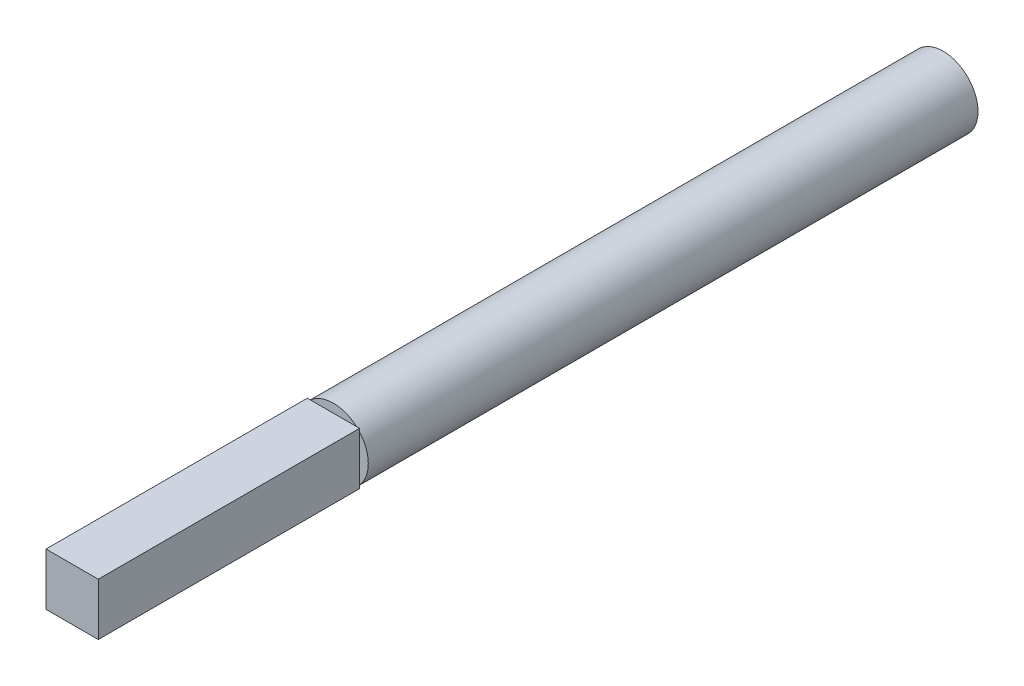
ISO-10303-21;
HEADER;
FILE_DESCRIPTION(('STEP AP214'),'2;1');
FILE_NAME('part.step','',(''),(''),'','','');
FILE_SCHEMA(('AUTOMOTIVE_DESIGN { 1 0 10303 214 1 1 1 1 }'));
ENDSEC;
DATA;
#1=APPLICATION_CONTEXT('core data for automotive mechanical design processes');
#2=APPLICATION_PROTOCOL_DEFINITION('international standard','automotive_design',2000,#1);
#3=PRODUCT_CONTEXT('',#1,'mechanical');
#4=PRODUCT('Part','Part','',(#3));
#5=PRODUCT_RELATED_PRODUCT_CATEGORY('part','',(#4));
#6=PRODUCT_DEFINITION_FORMATION('','',#4);
#7=PRODUCT_DEFINITION_CONTEXT('part definition',#1,'design');
#8=PRODUCT_DEFINITION('design','',#6,#7);
#9=PRODUCT_DEFINITION_SHAPE('','',#8);
#10=(LENGTH_UNIT() NAMED_UNIT(*) SI_UNIT(.MILLI.,.METRE.));
#11=(NAMED_UNIT(*) PLANE_ANGLE_UNIT() SI_UNIT($,.RADIAN.));
#12=(NAMED_UNIT(*) SI_UNIT($,.STERADIAN.) SOLID_ANGLE_UNIT());
#13=UNCERTAINTY_MEASURE_WITH_UNIT(LENGTH_MEASURE(1.E-05),#10,'distance_accuracy_value','');
#14=(GEOMETRIC_REPRESENTATION_CONTEXT(3) GLOBAL_UNCERTAINTY_ASSIGNED_CONTEXT((#13)) GLOBAL_UNIT_ASSIGNED_CONTEXT((#10,
#11,#12)) REPRESENTATION_CONTEXT('',''));
#15=CARTESIAN_POINT('',(0.,0.,0.));
#16=DIRECTION('',(0.,0.,1.));
#17=DIRECTION('',(1.,0.,0.));
#18=AXIS2_PLACEMENT_3D('',#15,#16,#17);
#19=CARTESIAN_POINT('',(0.,0.,88.9));
#20=DIRECTION('',(0.,0.,1.));
#21=DIRECTION('',(1.,0.,0.));
#22=AXIS2_PLACEMENT_3D('',#19,#20,#21);
#23=PLANE('',#22);
#24=DIRECTION('',(0.,1.,0.));
#25=VECTOR('',#24,1.);
#26=CARTESIAN_POINT('',(3.81,3.81,88.9));
#27=LINE('',#26,#25);
#28=CARTESIAN_POINT('',(3.81,-3.36010416505203,88.9));
#29=VERTEX_POINT('',#28);
#30=CARTESIAN_POINT('',(3.81,3.36010416505203,88.9));
#31=VERTEX_POINT('',#30);
#32=EDGE_CURVE('E11',#29,#31,#27,.T.);
#33=ORIENTED_EDGE('',*,*,#32,.F.);
#34=CARTESIAN_POINT('',(0.,0.,88.9));
#35=DIRECTION('',(0.,0.,1.));
#36=DIRECTION('',(1.,0.,0.));
#37=AXIS2_PLACEMENT_3D('',#34,#35,#36);
#38=CIRCLE('',#37,5.08);
#39=EDGE_CURVE('E129',#29,#31,#38,.T.);
#40=ORIENTED_EDGE('',*,*,#39,.T.);
#41=EDGE_LOOP('',(#33,#40));
#42=FACE_BOUND('',#41,.T.);
#43=ADVANCED_FACE('F33',(#42),#23,.T.);
#44=DIRECTION('',(1.,0.,0.));
#45=VECTOR('',#44,1.);
#46=CARTESIAN_POINT('',(-3.81,-3.81,88.9));
#47=LINE('',#46,#45);
#48=CARTESIAN_POINT('',(-3.36010416505203,-3.81,88.9));
#49=VERTEX_POINT('',#48);
#50=CARTESIAN_POINT('',(3.36010416505203,-3.81,88.9));
#51=VERTEX_POINT('',#50);
#52=EDGE_CURVE('E42',#49,#51,#47,.T.);
#53=ORIENTED_EDGE('',*,*,#52,.F.);
#54=EDGE_CURVE('E145',#49,#51,#38,.T.);
#55=ORIENTED_EDGE('',*,*,#54,.T.);
#56=EDGE_LOOP('',(#53,#55));
#57=FACE_BOUND('',#56,.T.);
#58=ADVANCED_FACE('F203',(#57),#23,.T.);
#59=DIRECTION('',(0.,-1.,0.));
#60=VECTOR('',#59,1.);
#61=CARTESIAN_POINT('',(-3.81,3.81,88.9));
#62=LINE('',#61,#60);
#63=CARTESIAN_POINT('',(-3.81,3.36010416505203,88.9));
#64=VERTEX_POINT('',#63);
#65=CARTESIAN_POINT('',(-3.81,-3.36010416505203,88.9));
#66=VERTEX_POINT('',#65);
#67=EDGE_CURVE('E140',#64,#66,#62,.T.);
#68=ORIENTED_EDGE('',*,*,#67,.F.);
#69=EDGE_CURVE('E152',#64,#66,#38,.T.);
#70=ORIENTED_EDGE('',*,*,#69,.T.);
#71=EDGE_LOOP('',(#68,#70));
#72=FACE_BOUND('',#71,.T.);
#73=ADVANCED_FACE('F208',(#72),#23,.T.);
#74=CARTESIAN_POINT('',(0.,0.,88.9));
#75=DIRECTION('',(0.,0.,-1.));
#76=DIRECTION('',(-1.,0.,0.));
#77=AXIS2_PLACEMENT_3D('',#74,#75,#76);
#78=CYLINDRICAL_SURFACE('',#77,5.08);
#79=CARTESIAN_POINT('',(3.36010416505203,3.81,88.9));
#80=VERTEX_POINT('',#79);
#81=EDGE_CURVE('E133',#31,#80,#38,.T.);
#82=ORIENTED_EDGE('',*,*,#81,.F.);
#83=ORIENTED_EDGE('',*,*,#39,.F.);
#84=EDGE_CURVE('E56',#51,#29,#38,.T.);
#85=ORIENTED_EDGE('',*,*,#84,.F.);
#86=ORIENTED_EDGE('',*,*,#54,.F.);
#87=EDGE_CURVE('E149',#66,#49,#38,.T.);
#88=ORIENTED_EDGE('',*,*,#87,.F.);
#89=ORIENTED_EDGE('',*,*,#69,.F.);
#90=CARTESIAN_POINT('',(-3.36010416505203,3.81,88.9));
#91=VERTEX_POINT('',#90);
#92=EDGE_CURVE('E144',#91,#64,#38,.T.);
#93=ORIENTED_EDGE('',*,*,#92,.F.);
#94=EDGE_CURVE('E136',#80,#91,#38,.T.);
#95=ORIENTED_EDGE('',*,*,#94,.F.);
#96=EDGE_LOOP('',(#82,#83,#85,#86,#88,#89,#93,#95));
#97=FACE_BOUND('',#96,.T.);
#98=CARTESIAN_POINT('',(0.,0.,0.));
#99=DIRECTION('',(0.,0.,1.));
#100=DIRECTION('',(1.,0.,0.));
#101=AXIS2_PLACEMENT_3D('',#98,#99,#100);
#102=CIRCLE('',#101,5.08);
#103=CARTESIAN_POINT('',(5.08,0.,0.));
#104=VERTEX_POINT('',#103);
#105=EDGE_CURVE('E37',#104,#104,#102,.T.);
#106=ORIENTED_EDGE('',*,*,#105,.T.);
#107=EDGE_LOOP('',(#106));
#108=FACE_BOUND('',#107,.T.);
#109=ADVANCED_FACE('F35',(#97,#108),#78,.T.);
#110=DIRECTION('',(-1.,0.,0.));
#111=VECTOR('',#110,1.);
#112=CARTESIAN_POINT('',(-3.81,3.81,88.9));
#113=LINE('',#112,#111);
#114=EDGE_CURVE('E135',#80,#91,#113,.T.);
#115=ORIENTED_EDGE('',*,*,#114,.F.);
#116=ORIENTED_EDGE('',*,*,#94,.T.);
#117=EDGE_LOOP('',(#115,#116));
#118=FACE_BOUND('',#117,.T.);
#119=ADVANCED_FACE('F187',(#118),#23,.T.);
#120=CARTESIAN_POINT('',(0.,0.,0.));
#121=DIRECTION('',(0.,0.,1.));
#122=DIRECTION('',(1.,0.,0.));
#123=AXIS2_PLACEMENT_3D('',#120,#121,#122);
#124=PLANE('',#123);
#125=ORIENTED_EDGE('',*,*,#105,.F.);
#126=EDGE_LOOP('',(#125));
#127=FACE_BOUND('',#126,.T.);
#128=ADVANCED_FACE('F201',(#127),#124,.F.);
#129=CARTESIAN_POINT('',(0.,0.,88.9));
#130=DIRECTION('',(0.,0.,1.));
#131=DIRECTION('',(1.,0.,0.));
#132=AXIS2_PLACEMENT_3D('',#129,#130,#131);
#133=PLANE('',#132);
#134=CARTESIAN_POINT('',(3.81,3.81,88.9));
#135=VERTEX_POINT('',#134);
#136=EDGE_CURVE('E45',#31,#135,#27,.T.);
#137=ORIENTED_EDGE('',*,*,#136,.F.);
#138=ORIENTED_EDGE('',*,*,#81,.T.);
#139=EDGE_CURVE('E142',#135,#80,#113,.T.);
#140=ORIENTED_EDGE('',*,*,#139,.F.);
#141=EDGE_LOOP('',(#137,#138,#140));
#142=FACE_BOUND('',#141,.T.);
#143=ADVANCED_FACE('F189',(#142),#133,.F.);
#144=CARTESIAN_POINT('',(-3.81,3.81,88.9));
#145=VERTEX_POINT('',#144);
#146=EDGE_CURVE('E143',#91,#145,#113,.T.);
#147=ORIENTED_EDGE('',*,*,#146,.F.);
#148=ORIENTED_EDGE('',*,*,#92,.T.);
#149=EDGE_CURVE('E167',#145,#64,#62,.T.);
#150=ORIENTED_EDGE('',*,*,#149,.F.);
#151=EDGE_LOOP('',(#147,#148,#150));
#152=FACE_BOUND('',#151,.T.);
#153=ADVANCED_FACE('F166',(#152),#133,.F.);
#154=CARTESIAN_POINT('',(-3.81,-3.81,88.9));
#155=VERTEX_POINT('',#154);
#156=EDGE_CURVE('E173',#66,#155,#62,.T.);
#157=ORIENTED_EDGE('',*,*,#156,.F.);
#158=ORIENTED_EDGE('',*,*,#87,.T.);
#159=EDGE_CURVE('E121',#155,#49,#47,.T.);
#160=ORIENTED_EDGE('',*,*,#159,.F.);
#161=EDGE_LOOP('',(#157,#158,#160));
#162=FACE_BOUND('',#161,.T.);
#163=ADVANCED_FACE('F182',(#162),#133,.F.);
#164=CARTESIAN_POINT('',(3.81,-3.81,88.9));
#165=VERTEX_POINT('',#164);
#166=EDGE_CURVE('E172',#51,#165,#47,.T.);
#167=ORIENTED_EDGE('',*,*,#166,.F.);
#168=ORIENTED_EDGE('',*,*,#84,.T.);
#169=EDGE_CURVE('E44',#165,#29,#27,.T.);
#170=ORIENTED_EDGE('',*,*,#169,.F.);
#171=EDGE_LOOP('',(#167,#168,#170));
#172=FACE_BOUND('',#171,.T.);
#173=ADVANCED_FACE('F190',(#172),#133,.F.);
#174=CARTESIAN_POINT('',(3.81,3.81,127.));
#175=DIRECTION('',(-1.,0.,0.));
#176=DIRECTION('',(0.,-1.,0.));
#177=AXIS2_PLACEMENT_3D('',#174,#175,#176);
#178=PLANE('',#177);
#179=ORIENTED_EDGE('',*,*,#169,.T.);
#180=ORIENTED_EDGE('',*,*,#32,.T.);
#181=ORIENTED_EDGE('',*,*,#136,.T.);
#182=DIRECTION('',(0.,0.,-1.));
#183=VECTOR('',#182,1.);
#184=CARTESIAN_POINT('',(3.81,3.81,127.));
#185=LINE('',#184,#183);
#186=CARTESIAN_POINT('',(3.81,3.81,127.));
#187=VERTEX_POINT('',#186);
#188=EDGE_CURVE('E106',#187,#135,#185,.T.);
#189=ORIENTED_EDGE('',*,*,#188,.F.);
#190=DIRECTION('',(0.,1.,0.));
#191=VECTOR('',#190,1.);
#192=CARTESIAN_POINT('',(3.81,3.81,127.));
#193=LINE('',#192,#191);
#194=CARTESIAN_POINT('',(3.81,-3.81,127.));
#195=VERTEX_POINT('',#194);
#196=EDGE_CURVE('E112',#195,#187,#193,.T.);
#197=ORIENTED_EDGE('',*,*,#196,.F.);
#198=DIRECTION('',(0.,0.,-1.));
#199=VECTOR('',#198,1.);
#200=CARTESIAN_POINT('',(3.81,-3.81,127.));
#201=LINE('',#200,#199);
#202=EDGE_CURVE('E183',#195,#165,#201,.T.);
#203=ORIENTED_EDGE('',*,*,#202,.T.);
#204=EDGE_LOOP('',(#179,#180,#181,#189,#197,#203));
#205=FACE_BOUND('',#204,.T.);
#206=ADVANCED_FACE('F124',(#205),#178,.F.);
#207=CARTESIAN_POINT('',(-3.81,3.81,127.));
#208=DIRECTION('',(0.,-1.,0.));
#209=DIRECTION('',(0.,0.,-1.));
#210=AXIS2_PLACEMENT_3D('',#207,#208,#209);
#211=PLANE('',#210);
#212=ORIENTED_EDGE('',*,*,#139,.T.);
#213=ORIENTED_EDGE('',*,*,#114,.T.);
#214=ORIENTED_EDGE('',*,*,#146,.T.);
#215=DIRECTION('',(0.,0.,-1.));
#216=VECTOR('',#215,1.);
#217=CARTESIAN_POINT('',(-3.81,3.81,127.));
#218=LINE('',#217,#216);
#219=CARTESIAN_POINT('',(-3.81,3.81,127.));
#220=VERTEX_POINT('',#219);
#221=EDGE_CURVE('E108',#220,#145,#218,.T.);
#222=ORIENTED_EDGE('',*,*,#221,.F.);
#223=DIRECTION('',(-1.,0.,0.));
#224=VECTOR('',#223,1.);
#225=CARTESIAN_POINT('',(-3.81,3.81,127.));
#226=LINE('',#225,#224);
#227=EDGE_CURVE('E101',#187,#220,#226,.T.);
#228=ORIENTED_EDGE('',*,*,#227,.F.);
#229=ORIENTED_EDGE('',*,*,#188,.T.);
#230=EDGE_LOOP('',(#212,#213,#214,#222,#228,#229));
#231=FACE_BOUND('',#230,.T.);
#232=ADVANCED_FACE('F104',(#231),#211,.F.);
#233=CARTESIAN_POINT('',(-3.81,3.81,127.));
#234=DIRECTION('',(1.,0.,0.));
#235=DIRECTION('',(0.,0.,-1.));
#236=AXIS2_PLACEMENT_3D('',#233,#234,#235);
#237=PLANE('',#236);
#238=ORIENTED_EDGE('',*,*,#149,.T.);
#239=ORIENTED_EDGE('',*,*,#67,.T.);
#240=ORIENTED_EDGE('',*,*,#156,.T.);
#241=DIRECTION('',(0.,0.,-1.));
#242=VECTOR('',#241,1.);
#243=CARTESIAN_POINT('',(-3.81,-3.81,127.));
#244=LINE('',#243,#242);
#245=CARTESIAN_POINT('',(-3.81,-3.81,127.));
#246=VERTEX_POINT('',#245);
#247=EDGE_CURVE('E130',#246,#155,#244,.T.);
#248=ORIENTED_EDGE('',*,*,#247,.F.);
#249=DIRECTION('',(0.,-1.,0.));
#250=VECTOR('',#249,1.);
#251=CARTESIAN_POINT('',(-3.81,3.81,127.));
#252=LINE('',#251,#250);
#253=EDGE_CURVE('E111',#220,#246,#252,.T.);
#254=ORIENTED_EDGE('',*,*,#253,.F.);
#255=ORIENTED_EDGE('',*,*,#221,.T.);
#256=EDGE_LOOP('',(#238,#239,#240,#248,#254,#255));
#257=FACE_BOUND('',#256,.T.);
#258=ADVANCED_FACE('F171',(#257),#237,.F.);
#259=CARTESIAN_POINT('',(-3.81,-3.81,127.));
#260=DIRECTION('',(0.,1.,0.));
#261=DIRECTION('',(0.,0.,1.));
#262=AXIS2_PLACEMENT_3D('',#259,#260,#261);
#263=PLANE('',#262);
#264=ORIENTED_EDGE('',*,*,#159,.T.);
#265=ORIENTED_EDGE('',*,*,#52,.T.);
#266=ORIENTED_EDGE('',*,*,#166,.T.);
#267=ORIENTED_EDGE('',*,*,#202,.F.);
#268=DIRECTION('',(1.,0.,0.));
#269=VECTOR('',#268,1.);
#270=CARTESIAN_POINT('',(-3.81,-3.81,127.));
#271=LINE('',#270,#269);
#272=EDGE_CURVE('E117',#246,#195,#271,.T.);
#273=ORIENTED_EDGE('',*,*,#272,.F.);
#274=ORIENTED_EDGE('',*,*,#247,.T.);
#275=EDGE_LOOP('',(#264,#265,#266,#267,#273,#274));
#276=FACE_BOUND('',#275,.T.);
#277=ADVANCED_FACE('F180',(#276),#263,.F.);
#278=CARTESIAN_POINT('',(0.,0.,127.));
#279=DIRECTION('',(0.,0.,1.));
#280=DIRECTION('',(1.,0.,0.));
#281=AXIS2_PLACEMENT_3D('',#278,#279,#280);
#282=PLANE('',#281);
#283=ORIENTED_EDGE('',*,*,#196,.T.);
#284=ORIENTED_EDGE('',*,*,#227,.T.);
#285=ORIENTED_EDGE('',*,*,#253,.T.);
#286=ORIENTED_EDGE('',*,*,#272,.T.);
#287=EDGE_LOOP('',(#283,#284,#285,#286));
#288=FACE_BOUND('',#287,.T.);
#289=ADVANCED_FACE('F115',(#288),#282,.T.);
#290=CLOSED_SHELL('',(#43,#58,#73,#109,#119,#128,#143,#153,#163,#173,#206,#232,#258,#277,#289));
#291=MANIFOLD_SOLID_BREP('B2',#290);
#292=ADVANCED_BREP_SHAPE_REPRESENTATION('',(#18,#291),#14);
#293=SHAPE_DEFINITION_REPRESENTATION(#9,#292);
ENDSEC;
END-ISO-10303-21;
